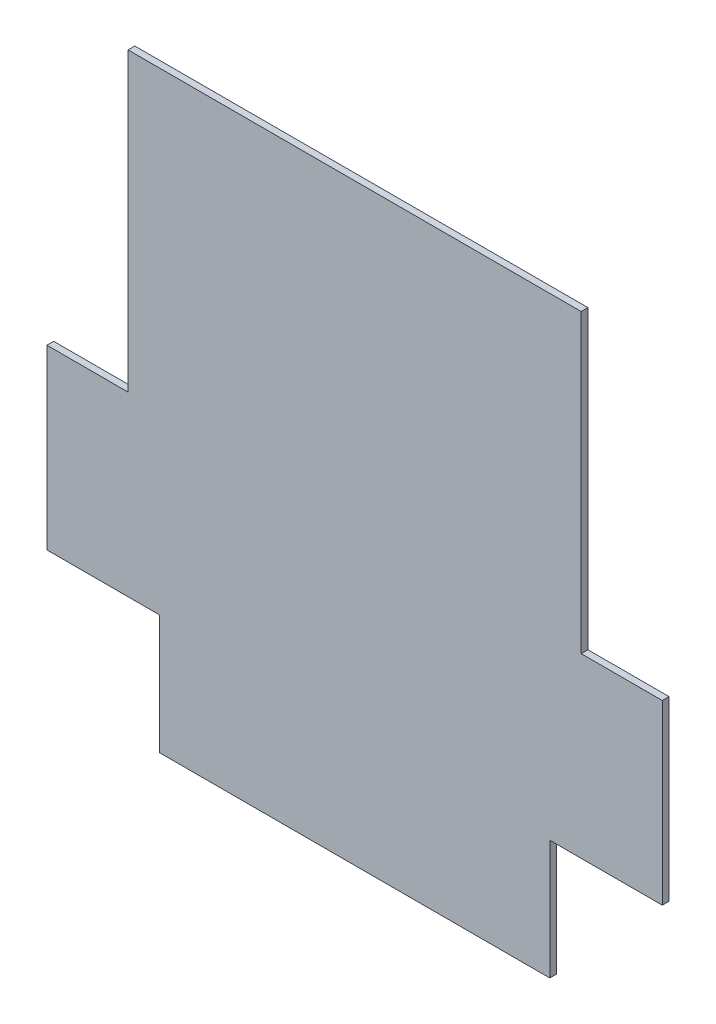
ISO-10303-21;
HEADER;
FILE_DESCRIPTION(('STEP AP214'),'2;1');
FILE_NAME('part.step','',(''),(''),'','','');
FILE_SCHEMA(('AUTOMOTIVE_DESIGN { 1 0 10303 214 1 1 1 1 }'));
ENDSEC;
DATA;
#1=APPLICATION_CONTEXT('core data for automotive mechanical design processes');
#2=APPLICATION_PROTOCOL_DEFINITION('international standard','automotive_design',2000,#1);
#3=PRODUCT_CONTEXT('',#1,'mechanical');
#4=PRODUCT('Part','Part','',(#3));
#5=PRODUCT_RELATED_PRODUCT_CATEGORY('part','',(#4));
#6=PRODUCT_DEFINITION_FORMATION('','',#4);
#7=PRODUCT_DEFINITION_CONTEXT('part definition',#1,'design');
#8=PRODUCT_DEFINITION('design','',#6,#7);
#9=PRODUCT_DEFINITION_SHAPE('','',#8);
#10=(LENGTH_UNIT() NAMED_UNIT(*) SI_UNIT(.MILLI.,.METRE.));
#11=(NAMED_UNIT(*) PLANE_ANGLE_UNIT() SI_UNIT($,.RADIAN.));
#12=(NAMED_UNIT(*) SI_UNIT($,.STERADIAN.) SOLID_ANGLE_UNIT());
#13=UNCERTAINTY_MEASURE_WITH_UNIT(LENGTH_MEASURE(1.E-05),#10,'distance_accuracy_value','');
#14=(GEOMETRIC_REPRESENTATION_CONTEXT(3) GLOBAL_UNCERTAINTY_ASSIGNED_CONTEXT((#13)) GLOBAL_UNIT_ASSIGNED_CONTEXT((#10,
#11,#12)) REPRESENTATION_CONTEXT('',''));
#15=CARTESIAN_POINT('',(0.,0.,0.));
#16=DIRECTION('',(0.,0.,1.));
#17=DIRECTION('',(1.,0.,0.));
#18=AXIS2_PLACEMENT_3D('',#15,#16,#17);
#19=CARTESIAN_POINT('',(0.,0.,3.));
#20=DIRECTION('',(1.,0.,0.));
#21=DIRECTION('',(0.,1.,0.));
#22=AXIS2_PLACEMENT_3D('',#19,#20,#21);
#23=PLANE('',#22);
#24=DIRECTION('',(0.,-1.,0.));
#25=VECTOR('',#24,1.);
#26=CARTESIAN_POINT('',(0.,0.,0.));
#27=LINE('',#26,#25);
#28=CARTESIAN_POINT('',(0.,-131.64,0.));
#29=VERTEX_POINT('',#28);
#30=CARTESIAN_POINT('',(0.,-210.4,0.));
#31=VERTEX_POINT('',#30);
#32=EDGE_CURVE('E151',#29,#31,#27,.T.);
#33=ORIENTED_EDGE('',*,*,#32,.T.);
#34=DIRECTION('',(0.,0.,1.));
#35=VECTOR('',#34,1.);
#36=CARTESIAN_POINT('',(0.,-210.4,0.));
#37=LINE('',#36,#35);
#38=CARTESIAN_POINT('',(0.,-210.4,3.));
#39=VERTEX_POINT('',#38);
#40=EDGE_CURVE('E176',#31,#39,#37,.T.);
#41=ORIENTED_EDGE('',*,*,#40,.T.);
#42=DIRECTION('',(0.,-1.,0.));
#43=VECTOR('',#42,1.);
#44=CARTESIAN_POINT('',(0.,0.,3.));
#45=LINE('',#44,#43);
#46=CARTESIAN_POINT('',(0.,-131.64,3.));
#47=VERTEX_POINT('',#46);
#48=EDGE_CURVE('E149',#47,#39,#45,.T.);
#49=ORIENTED_EDGE('',*,*,#48,.F.);
#50=DIRECTION('',(0.,0.,1.));
#51=VECTOR('',#50,1.);
#52=CARTESIAN_POINT('',(0.,-131.64,0.));
#53=LINE('',#52,#51);
#54=EDGE_CURVE('E163',#29,#47,#53,.T.);
#55=ORIENTED_EDGE('',*,*,#54,.F.);
#56=EDGE_LOOP('',(#33,#41,#49,#55));
#57=FACE_BOUND('',#56,.T.);
#58=ADVANCED_FACE('F33',(#57),#23,.F.);
#59=CARTESIAN_POINT('',(0.,-263.4,3.));
#60=DIRECTION('',(0.,1.,0.));
#61=DIRECTION('',(0.,0.,1.));
#62=AXIS2_PLACEMENT_3D('',#59,#60,#61);
#63=PLANE('',#62);
#64=DIRECTION('',(1.,0.,0.));
#65=VECTOR('',#64,1.);
#66=CARTESIAN_POINT('',(0.,-263.4,3.));
#67=LINE('',#66,#65);
#68=CARTESIAN_POINT('',(50.,-263.4,3.));
#69=VERTEX_POINT('',#68);
#70=CARTESIAN_POINT('',(223.4,-263.4,3.));
#71=VERTEX_POINT('',#70);
#72=EDGE_CURVE('E158',#69,#71,#67,.T.);
#73=ORIENTED_EDGE('',*,*,#72,.F.);
#74=DIRECTION('',(0.,0.,1.));
#75=VECTOR('',#74,1.);
#76=CARTESIAN_POINT('',(50.,-263.4,0.));
#77=LINE('',#76,#75);
#78=CARTESIAN_POINT('',(50.,-263.4,0.));
#79=VERTEX_POINT('',#78);
#80=EDGE_CURVE('E197',#79,#69,#77,.T.);
#81=ORIENTED_EDGE('',*,*,#80,.F.);
#82=DIRECTION('',(1.,0.,0.));
#83=VECTOR('',#82,1.);
#84=CARTESIAN_POINT('',(0.,-263.4,0.));
#85=LINE('',#84,#83);
#86=CARTESIAN_POINT('',(223.4,-263.4,0.));
#87=VERTEX_POINT('',#86);
#88=EDGE_CURVE('E147',#79,#87,#85,.T.);
#89=ORIENTED_EDGE('',*,*,#88,.T.);
#90=DIRECTION('',(0.,0.,1.));
#91=VECTOR('',#90,1.);
#92=CARTESIAN_POINT('',(223.4,-263.4,0.));
#93=LINE('',#92,#91);
#94=EDGE_CURVE('E194',#87,#71,#93,.T.);
#95=ORIENTED_EDGE('',*,*,#94,.T.);
#96=EDGE_LOOP('',(#73,#81,#89,#95));
#97=FACE_BOUND('',#96,.T.);
#98=ADVANCED_FACE('F221',(#97),#63,.F.);
#99=CARTESIAN_POINT('',(273.4,0.,3.));
#100=DIRECTION('',(-1.,0.,0.));
#101=DIRECTION('',(0.,-1.,0.));
#102=AXIS2_PLACEMENT_3D('',#99,#100,#101);
#103=PLANE('',#102);
#104=DIRECTION('',(0.,1.,0.));
#105=VECTOR('',#104,1.);
#106=CARTESIAN_POINT('',(273.4,0.,0.));
#107=LINE('',#106,#105);
#108=CARTESIAN_POINT('',(273.4,-210.4,0.));
#109=VERTEX_POINT('',#108);
#110=CARTESIAN_POINT('',(273.4,-131.64,0.));
#111=VERTEX_POINT('',#110);
#112=EDGE_CURVE('E141',#109,#111,#107,.T.);
#113=ORIENTED_EDGE('',*,*,#112,.T.);
#114=DIRECTION('',(0.,0.,1.));
#115=VECTOR('',#114,1.);
#116=CARTESIAN_POINT('',(273.4,-131.64,0.));
#117=LINE('',#116,#115);
#118=CARTESIAN_POINT('',(273.4,-131.64,3.));
#119=VERTEX_POINT('',#118);
#120=EDGE_CURVE('E185',#111,#119,#117,.T.);
#121=ORIENTED_EDGE('',*,*,#120,.T.);
#122=DIRECTION('',(0.,1.,0.));
#123=VECTOR('',#122,1.);
#124=CARTESIAN_POINT('',(273.4,0.,3.));
#125=LINE('',#124,#123);
#126=CARTESIAN_POINT('',(273.4,-210.4,3.));
#127=VERTEX_POINT('',#126);
#128=EDGE_CURVE('E41',#127,#119,#125,.T.);
#129=ORIENTED_EDGE('',*,*,#128,.F.);
#130=DIRECTION('',(0.,0.,1.));
#131=VECTOR('',#130,1.);
#132=CARTESIAN_POINT('',(273.4,-210.4,0.));
#133=LINE('',#132,#131);
#134=EDGE_CURVE('E127',#109,#127,#133,.T.);
#135=ORIENTED_EDGE('',*,*,#134,.F.);
#136=EDGE_LOOP('',(#113,#121,#129,#135));
#137=FACE_BOUND('',#136,.T.);
#138=ADVANCED_FACE('F139',(#137),#103,.F.);
#139=CARTESIAN_POINT('',(0.,0.,3.));
#140=DIRECTION('',(0.,-1.,0.));
#141=DIRECTION('',(0.,0.,-1.));
#142=AXIS2_PLACEMENT_3D('',#139,#140,#141);
#143=PLANE('',#142);
#144=DIRECTION('',(-1.,0.,0.));
#145=VECTOR('',#144,1.);
#146=CARTESIAN_POINT('',(0.,0.,3.));
#147=LINE('',#146,#145);
#148=CARTESIAN_POINT('',(237.35,0.,3.));
#149=VERTEX_POINT('',#148);
#150=CARTESIAN_POINT('',(36.05,0.,3.));
#151=VERTEX_POINT('',#150);
#152=EDGE_CURVE('E11',#149,#151,#147,.T.);
#153=ORIENTED_EDGE('',*,*,#152,.F.);
#154=DIRECTION('',(0.,0.,1.));
#155=VECTOR('',#154,1.);
#156=CARTESIAN_POINT('',(237.35,0.,0.));
#157=LINE('',#156,#155);
#158=CARTESIAN_POINT('',(237.35,0.,0.));
#159=VERTEX_POINT('',#158);
#160=EDGE_CURVE('E181',#159,#149,#157,.T.);
#161=ORIENTED_EDGE('',*,*,#160,.F.);
#162=DIRECTION('',(-1.,0.,0.));
#163=VECTOR('',#162,1.);
#164=CARTESIAN_POINT('',(0.,0.,0.));
#165=LINE('',#164,#163);
#166=CARTESIAN_POINT('',(36.05,0.,0.));
#167=VERTEX_POINT('',#166);
#168=EDGE_CURVE('E36',#159,#167,#165,.T.);
#169=ORIENTED_EDGE('',*,*,#168,.T.);
#170=DIRECTION('',(0.,0.,1.));
#171=VECTOR('',#170,1.);
#172=CARTESIAN_POINT('',(36.05,0.,0.));
#173=LINE('',#172,#171);
#174=EDGE_CURVE('E155',#167,#151,#173,.T.);
#175=ORIENTED_EDGE('',*,*,#174,.T.);
#176=EDGE_LOOP('',(#153,#161,#169,#175));
#177=FACE_BOUND('',#176,.T.);
#178=ADVANCED_FACE('F244',(#177),#143,.F.);
#179=CARTESIAN_POINT('',(0.,0.,3.));
#180=DIRECTION('',(0.,0.,1.));
#181=DIRECTION('',(1.,0.,0.));
#182=AXIS2_PLACEMENT_3D('',#179,#180,#181);
#183=PLANE('',#182);
#184=DIRECTION('',(-1.,0.,0.));
#185=VECTOR('',#184,1.);
#186=CARTESIAN_POINT('',(0.,-210.4,3.));
#187=LINE('',#186,#185);
#188=CARTESIAN_POINT('',(50.,-210.4,3.));
#189=VERTEX_POINT('',#188);
#190=EDGE_CURVE('E203',#189,#39,#187,.T.);
#191=ORIENTED_EDGE('',*,*,#190,.F.);
#192=DIRECTION('',(0.,1.,0.));
#193=VECTOR('',#192,1.);
#194=CARTESIAN_POINT('',(50.,-263.4,3.));
#195=LINE('',#194,#193);
#196=EDGE_CURVE('E187',#69,#189,#195,.T.);
#197=ORIENTED_EDGE('',*,*,#196,.F.);
#198=ORIENTED_EDGE('',*,*,#72,.T.);
#199=DIRECTION('',(0.,-1.,0.));
#200=VECTOR('',#199,1.);
#201=CARTESIAN_POINT('',(223.4,-263.4,3.));
#202=LINE('',#201,#200);
#203=CARTESIAN_POINT('',(223.4,-210.4,3.));
#204=VERTEX_POINT('',#203);
#205=EDGE_CURVE('E134',#204,#71,#202,.T.);
#206=ORIENTED_EDGE('',*,*,#205,.F.);
#207=DIRECTION('',(-1.,0.,0.));
#208=VECTOR('',#207,1.);
#209=CARTESIAN_POINT('',(273.4,-210.4,3.));
#210=LINE('',#209,#208);
#211=EDGE_CURVE('E214',#127,#204,#210,.T.);
#212=ORIENTED_EDGE('',*,*,#211,.F.);
#213=ORIENTED_EDGE('',*,*,#128,.T.);
#214=DIRECTION('',(1.,0.,0.));
#215=VECTOR('',#214,1.);
#216=CARTESIAN_POINT('',(273.4,-131.64,3.));
#217=LINE('',#216,#215);
#218=CARTESIAN_POINT('',(237.35,-131.64,3.));
#219=VERTEX_POINT('',#218);
#220=EDGE_CURVE('E188',#219,#119,#217,.T.);
#221=ORIENTED_EDGE('',*,*,#220,.F.);
#222=DIRECTION('',(0.,-1.,0.));
#223=VECTOR('',#222,1.);
#224=CARTESIAN_POINT('',(237.35,0.,3.));
#225=LINE('',#224,#223);
#226=EDGE_CURVE('E191',#149,#219,#225,.T.);
#227=ORIENTED_EDGE('',*,*,#226,.F.);
#228=ORIENTED_EDGE('',*,*,#152,.T.);
#229=DIRECTION('',(0.,1.,0.));
#230=VECTOR('',#229,1.);
#231=CARTESIAN_POINT('',(36.05,0.,3.));
#232=LINE('',#231,#230);
#233=CARTESIAN_POINT('',(36.05,-131.64,3.));
#234=VERTEX_POINT('',#233);
#235=EDGE_CURVE('E170',#234,#151,#232,.T.);
#236=ORIENTED_EDGE('',*,*,#235,.F.);
#237=DIRECTION('',(1.,0.,0.));
#238=VECTOR('',#237,1.);
#239=CARTESIAN_POINT('',(0.,-131.64,3.));
#240=LINE('',#239,#238);
#241=EDGE_CURVE('E173',#47,#234,#240,.T.);
#242=ORIENTED_EDGE('',*,*,#241,.F.);
#243=ORIENTED_EDGE('',*,*,#48,.T.);
#244=EDGE_LOOP('',(#191,#197,#198,#206,#212,#213,#221,#227,#228,#236,#242,#243));
#245=FACE_BOUND('',#244,.T.);
#246=ADVANCED_FACE('F227',(#245),#183,.T.);
#247=CARTESIAN_POINT('',(0.,0.,0.));
#248=DIRECTION('',(0.,0.,1.));
#249=DIRECTION('',(1.,0.,0.));
#250=AXIS2_PLACEMENT_3D('',#247,#248,#249);
#251=PLANE('',#250);
#252=DIRECTION('',(0.,1.,0.));
#253=VECTOR('',#252,1.);
#254=CARTESIAN_POINT('',(50.,-263.4,0.));
#255=LINE('',#254,#253);
#256=CARTESIAN_POINT('',(50.,-210.4,0.));
#257=VERTEX_POINT('',#256);
#258=EDGE_CURVE('E205',#79,#257,#255,.T.);
#259=ORIENTED_EDGE('',*,*,#258,.T.);
#260=DIRECTION('',(-1.,0.,0.));
#261=VECTOR('',#260,1.);
#262=CARTESIAN_POINT('',(0.,-210.4,0.));
#263=LINE('',#262,#261);
#264=EDGE_CURVE('E49',#257,#31,#263,.T.);
#265=ORIENTED_EDGE('',*,*,#264,.T.);
#266=ORIENTED_EDGE('',*,*,#32,.F.);
#267=DIRECTION('',(1.,0.,0.));
#268=VECTOR('',#267,1.);
#269=CARTESIAN_POINT('',(0.,-131.64,0.));
#270=LINE('',#269,#268);
#271=CARTESIAN_POINT('',(36.05,-131.64,0.));
#272=VERTEX_POINT('',#271);
#273=EDGE_CURVE('E172',#29,#272,#270,.T.);
#274=ORIENTED_EDGE('',*,*,#273,.T.);
#275=DIRECTION('',(0.,1.,0.));
#276=VECTOR('',#275,1.);
#277=CARTESIAN_POINT('',(36.05,0.,0.));
#278=LINE('',#277,#276);
#279=EDGE_CURVE('E166',#272,#167,#278,.T.);
#280=ORIENTED_EDGE('',*,*,#279,.T.);
#281=ORIENTED_EDGE('',*,*,#168,.F.);
#282=DIRECTION('',(0.,-1.,0.));
#283=VECTOR('',#282,1.);
#284=CARTESIAN_POINT('',(237.35,0.,0.));
#285=LINE('',#284,#283);
#286=CARTESIAN_POINT('',(237.35,-131.64,0.));
#287=VERTEX_POINT('',#286);
#288=EDGE_CURVE('E190',#159,#287,#285,.T.);
#289=ORIENTED_EDGE('',*,*,#288,.T.);
#290=DIRECTION('',(1.,0.,0.));
#291=VECTOR('',#290,1.);
#292=CARTESIAN_POINT('',(273.4,-131.64,0.));
#293=LINE('',#292,#291);
#294=EDGE_CURVE('E57',#287,#111,#293,.T.);
#295=ORIENTED_EDGE('',*,*,#294,.T.);
#296=ORIENTED_EDGE('',*,*,#112,.F.);
#297=DIRECTION('',(-1.,0.,0.));
#298=VECTOR('',#297,1.);
#299=CARTESIAN_POINT('',(273.4,-210.4,0.));
#300=LINE('',#299,#298);
#301=CARTESIAN_POINT('',(223.4,-210.4,0.));
#302=VERTEX_POINT('',#301);
#303=EDGE_CURVE('E123',#109,#302,#300,.T.);
#304=ORIENTED_EDGE('',*,*,#303,.T.);
#305=DIRECTION('',(0.,-1.,0.));
#306=VECTOR('',#305,1.);
#307=CARTESIAN_POINT('',(223.4,-263.4,0.));
#308=LINE('',#307,#306);
#309=EDGE_CURVE('E133',#302,#87,#308,.T.);
#310=ORIENTED_EDGE('',*,*,#309,.T.);
#311=ORIENTED_EDGE('',*,*,#88,.F.);
#312=EDGE_LOOP('',(#259,#265,#266,#274,#280,#281,#289,#295,#296,#304,#310,#311));
#313=FACE_BOUND('',#312,.T.);
#314=ADVANCED_FACE('F145',(#313),#251,.F.);
#315=CARTESIAN_POINT('',(36.05,0.,0.));
#316=DIRECTION('',(1.,0.,0.));
#317=DIRECTION('',(0.,1.,0.));
#318=AXIS2_PLACEMENT_3D('',#315,#316,#317);
#319=PLANE('',#318);
#320=ORIENTED_EDGE('',*,*,#235,.T.);
#321=ORIENTED_EDGE('',*,*,#174,.F.);
#322=ORIENTED_EDGE('',*,*,#279,.F.);
#323=DIRECTION('',(0.,0.,1.));
#324=VECTOR('',#323,1.);
#325=CARTESIAN_POINT('',(36.05,-131.64,0.));
#326=LINE('',#325,#324);
#327=EDGE_CURVE('E165',#272,#234,#326,.T.);
#328=ORIENTED_EDGE('',*,*,#327,.T.);
#329=EDGE_LOOP('',(#320,#321,#322,#328));
#330=FACE_BOUND('',#329,.T.);
#331=ADVANCED_FACE('F241',(#330),#319,.F.);
#332=CARTESIAN_POINT('',(0.,-131.64,0.));
#333=DIRECTION('',(0.,-1.,0.));
#334=DIRECTION('',(0.,0.,-1.));
#335=AXIS2_PLACEMENT_3D('',#332,#333,#334);
#336=PLANE('',#335);
#337=ORIENTED_EDGE('',*,*,#241,.T.);
#338=ORIENTED_EDGE('',*,*,#327,.F.);
#339=ORIENTED_EDGE('',*,*,#273,.F.);
#340=ORIENTED_EDGE('',*,*,#54,.T.);
#341=EDGE_LOOP('',(#337,#338,#339,#340));
#342=FACE_BOUND('',#341,.T.);
#343=ADVANCED_FACE('F238',(#342),#336,.F.);
#344=CARTESIAN_POINT('',(223.4,-263.4,0.));
#345=DIRECTION('',(-1.,0.,0.));
#346=DIRECTION('',(0.,0.,1.));
#347=AXIS2_PLACEMENT_3D('',#344,#345,#346);
#348=PLANE('',#347);
#349=ORIENTED_EDGE('',*,*,#205,.T.);
#350=ORIENTED_EDGE('',*,*,#94,.F.);
#351=ORIENTED_EDGE('',*,*,#309,.F.);
#352=DIRECTION('',(0.,0.,1.));
#353=VECTOR('',#352,1.);
#354=CARTESIAN_POINT('',(223.4,-210.4,0.));
#355=LINE('',#354,#353);
#356=EDGE_CURVE('E129',#302,#204,#355,.T.);
#357=ORIENTED_EDGE('',*,*,#356,.T.);
#358=EDGE_LOOP('',(#349,#350,#351,#357));
#359=FACE_BOUND('',#358,.T.);
#360=ADVANCED_FACE('F251',(#359),#348,.F.);
#361=CARTESIAN_POINT('',(273.4,-210.4,0.));
#362=DIRECTION('',(0.,1.,0.));
#363=DIRECTION('',(0.,0.,1.));
#364=AXIS2_PLACEMENT_3D('',#361,#362,#363);
#365=PLANE('',#364);
#366=ORIENTED_EDGE('',*,*,#211,.T.);
#367=ORIENTED_EDGE('',*,*,#356,.F.);
#368=ORIENTED_EDGE('',*,*,#303,.F.);
#369=ORIENTED_EDGE('',*,*,#134,.T.);
#370=EDGE_LOOP('',(#366,#367,#368,#369));
#371=FACE_BOUND('',#370,.T.);
#372=ADVANCED_FACE('F126',(#371),#365,.F.);
#373=CARTESIAN_POINT('',(273.4,-131.64,0.));
#374=DIRECTION('',(0.,-1.,0.));
#375=DIRECTION('',(1.,0.,0.));
#376=AXIS2_PLACEMENT_3D('',#373,#374,#375);
#377=PLANE('',#376);
#378=ORIENTED_EDGE('',*,*,#220,.T.);
#379=ORIENTED_EDGE('',*,*,#120,.F.);
#380=ORIENTED_EDGE('',*,*,#294,.F.);
#381=DIRECTION('',(0.,0.,1.));
#382=VECTOR('',#381,1.);
#383=CARTESIAN_POINT('',(237.35,-131.64,0.));
#384=LINE('',#383,#382);
#385=EDGE_CURVE('E183',#287,#219,#384,.T.);
#386=ORIENTED_EDGE('',*,*,#385,.T.);
#387=EDGE_LOOP('',(#378,#379,#380,#386));
#388=FACE_BOUND('',#387,.T.);
#389=ADVANCED_FACE('F250',(#388),#377,.F.);
#390=CARTESIAN_POINT('',(237.35,0.,0.));
#391=DIRECTION('',(-1.,0.,0.));
#392=DIRECTION('',(0.,-1.,0.));
#393=AXIS2_PLACEMENT_3D('',#390,#391,#392);
#394=PLANE('',#393);
#395=ORIENTED_EDGE('',*,*,#226,.T.);
#396=ORIENTED_EDGE('',*,*,#385,.F.);
#397=ORIENTED_EDGE('',*,*,#288,.F.);
#398=ORIENTED_EDGE('',*,*,#160,.T.);
#399=EDGE_LOOP('',(#395,#396,#397,#398));
#400=FACE_BOUND('',#399,.T.);
#401=ADVANCED_FACE('F249',(#400),#394,.F.);
#402=CARTESIAN_POINT('',(0.,-210.4,0.));
#403=DIRECTION('',(0.,1.,0.));
#404=DIRECTION('',(0.,0.,1.));
#405=AXIS2_PLACEMENT_3D('',#402,#403,#404);
#406=PLANE('',#405);
#407=ORIENTED_EDGE('',*,*,#190,.T.);
#408=ORIENTED_EDGE('',*,*,#40,.F.);
#409=ORIENTED_EDGE('',*,*,#264,.F.);
#410=DIRECTION('',(0.,0.,1.));
#411=VECTOR('',#410,1.);
#412=CARTESIAN_POINT('',(50.,-210.4,0.));
#413=LINE('',#412,#411);
#414=EDGE_CURVE('E199',#257,#189,#413,.T.);
#415=ORIENTED_EDGE('',*,*,#414,.T.);
#416=EDGE_LOOP('',(#407,#408,#409,#415));
#417=FACE_BOUND('',#416,.T.);
#418=ADVANCED_FACE('F231',(#417),#406,.F.);
#419=CARTESIAN_POINT('',(50.,-263.4,0.));
#420=DIRECTION('',(1.,0.,0.));
#421=DIRECTION('',(0.,0.,-1.));
#422=AXIS2_PLACEMENT_3D('',#419,#420,#421);
#423=PLANE('',#422);
#424=ORIENTED_EDGE('',*,*,#196,.T.);
#425=ORIENTED_EDGE('',*,*,#414,.F.);
#426=ORIENTED_EDGE('',*,*,#258,.F.);
#427=ORIENTED_EDGE('',*,*,#80,.T.);
#428=EDGE_LOOP('',(#424,#425,#426,#427));
#429=FACE_BOUND('',#428,.T.);
#430=ADVANCED_FACE('F224',(#429),#423,.F.);
#431=CLOSED_SHELL('',(#58,#98,#138,#178,#246,#314,#331,#343,#360,#372,#389,#401,#418,#430));
#432=MANIFOLD_SOLID_BREP('B2',#431);
#433=ADVANCED_BREP_SHAPE_REPRESENTATION('',(#18,#432),#14);
#434=SHAPE_DEFINITION_REPRESENTATION(#9,#433);
ENDSEC;
END-ISO-10303-21;
